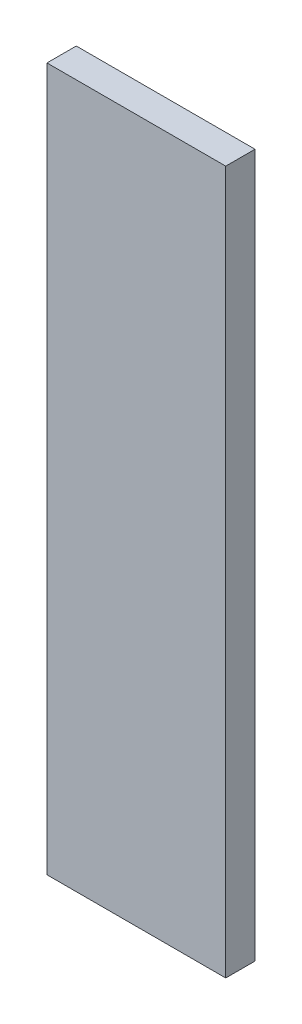
ISO-10303-21;
HEADER;
FILE_DESCRIPTION(('STEP AP214'),'2;1');
FILE_NAME('part.step','',(''),(''),'','','');
FILE_SCHEMA(('AUTOMOTIVE_DESIGN { 1 0 10303 214 1 1 1 1 }'));
ENDSEC;
DATA;
#1=APPLICATION_CONTEXT('core data for automotive mechanical design processes');
#2=APPLICATION_PROTOCOL_DEFINITION('international standard','automotive_design',2000,#1);
#3=PRODUCT_CONTEXT('',#1,'mechanical');
#4=PRODUCT('Part','Part','',(#3));
#5=PRODUCT_RELATED_PRODUCT_CATEGORY('part','',(#4));
#6=PRODUCT_DEFINITION_FORMATION('','',#4);
#7=PRODUCT_DEFINITION_CONTEXT('part definition',#1,'design');
#8=PRODUCT_DEFINITION('design','',#6,#7);
#9=PRODUCT_DEFINITION_SHAPE('','',#8);
#10=(LENGTH_UNIT() NAMED_UNIT(*) SI_UNIT(.MILLI.,.METRE.));
#11=(NAMED_UNIT(*) PLANE_ANGLE_UNIT() SI_UNIT($,.RADIAN.));
#12=(NAMED_UNIT(*) SI_UNIT($,.STERADIAN.) SOLID_ANGLE_UNIT());
#13=UNCERTAINTY_MEASURE_WITH_UNIT(LENGTH_MEASURE(1.E-05),#10,'distance_accuracy_value','');
#14=(GEOMETRIC_REPRESENTATION_CONTEXT(3) GLOBAL_UNCERTAINTY_ASSIGNED_CONTEXT((#13)) GLOBAL_UNIT_ASSIGNED_CONTEXT((#10,
#11,#12)) REPRESENTATION_CONTEXT('',''));
#15=CARTESIAN_POINT('',(0.,0.,0.));
#16=DIRECTION('',(0.,0.,1.));
#17=DIRECTION('',(1.,0.,0.));
#18=AXIS2_PLACEMENT_3D('',#15,#16,#17);
#19=CARTESIAN_POINT('',(-467.912060541022,58.5771354617902,6.35));
#20=DIRECTION('',(-1.,0.,0.));
#21=DIRECTION('',(0.,0.,1.));
#22=AXIS2_PLACEMENT_3D('',#19,#20,#21);
#23=PLANE('',#22);
#24=DIRECTION('',(0.,1.,0.));
#25=VECTOR('',#24,1.);
#26=CARTESIAN_POINT('',(-467.912060541022,58.5771354617902,0.));
#27=LINE('',#26,#25);
#28=CARTESIAN_POINT('',(-467.912060541022,58.5771354617902,0.));
#29=VERTEX_POINT('',#28);
#30=CARTESIAN_POINT('',(-467.912060541022,210.97713546179,0.));
#31=VERTEX_POINT('',#30);
#32=EDGE_CURVE('E102',#29,#31,#27,.T.);
#33=ORIENTED_EDGE('',*,*,#32,.F.);
#34=DIRECTION('',(0.,0.,-1.));
#35=VECTOR('',#34,1.);
#36=CARTESIAN_POINT('',(-467.912060541022,58.5771354617902,6.35));
#37=LINE('',#36,#35);
#38=CARTESIAN_POINT('',(-467.912060541022,58.5771354617902,6.35));
#39=VERTEX_POINT('',#38);
#40=EDGE_CURVE('E11',#39,#29,#37,.T.);
#41=ORIENTED_EDGE('',*,*,#40,.F.);
#42=DIRECTION('',(0.,1.,0.));
#43=VECTOR('',#42,1.);
#44=CARTESIAN_POINT('',(-467.912060541022,58.5771354617902,6.35));
#45=LINE('',#44,#43);
#46=CARTESIAN_POINT('',(-467.912060541022,210.97713546179,6.35));
#47=VERTEX_POINT('',#46);
#48=EDGE_CURVE('E97',#39,#47,#45,.T.);
#49=ORIENTED_EDGE('',*,*,#48,.T.);
#50=DIRECTION('',(0.,0.,-1.));
#51=VECTOR('',#50,1.);
#52=CARTESIAN_POINT('',(-467.912060541022,210.97713546179,6.35));
#53=LINE('',#52,#51);
#54=EDGE_CURVE('E40',#47,#31,#53,.T.);
#55=ORIENTED_EDGE('',*,*,#54,.T.);
#56=EDGE_LOOP('',(#33,#41,#49,#55));
#57=FACE_BOUND('',#56,.T.);
#58=ADVANCED_FACE('F37',(#57),#23,.T.);
#59=CARTESIAN_POINT('',(-467.912060541022,58.5771354617902,6.35));
#60=DIRECTION('',(0.,1.,0.));
#61=DIRECTION('',(-1.,0.,0.));
#62=AXIS2_PLACEMENT_3D('',#59,#60,#61);
#63=PLANE('',#62);
#64=DIRECTION('',(1.,0.,0.));
#65=VECTOR('',#64,1.);
#66=CARTESIAN_POINT('',(-467.912060541022,58.5771354617902,0.));
#67=LINE('',#66,#65);
#68=CARTESIAN_POINT('',(-429.164397652232,58.5771354617902,0.));
#69=VERTEX_POINT('',#68);
#70=EDGE_CURVE('E70',#29,#69,#67,.T.);
#71=ORIENTED_EDGE('',*,*,#70,.T.);
#72=DIRECTION('',(0.,0.,-1.));
#73=VECTOR('',#72,1.);
#74=CARTESIAN_POINT('',(-429.164397652232,58.5771354617902,6.35));
#75=LINE('',#74,#73);
#76=CARTESIAN_POINT('',(-429.164397652232,58.5771354617902,6.35));
#77=VERTEX_POINT('',#76);
#78=EDGE_CURVE('E46',#77,#69,#75,.T.);
#79=ORIENTED_EDGE('',*,*,#78,.F.);
#80=DIRECTION('',(1.,0.,0.));
#81=VECTOR('',#80,1.);
#82=CARTESIAN_POINT('',(-467.912060541022,58.5771354617902,6.35));
#83=LINE('',#82,#81);
#84=EDGE_CURVE('E87',#39,#77,#83,.T.);
#85=ORIENTED_EDGE('',*,*,#84,.F.);
#86=ORIENTED_EDGE('',*,*,#40,.T.);
#87=EDGE_LOOP('',(#71,#79,#85,#86));
#88=FACE_BOUND('',#87,.T.);
#89=ADVANCED_FACE('F112',(#88),#63,.F.);
#90=CARTESIAN_POINT('',(-429.164397652232,58.5771354617902,6.35));
#91=DIRECTION('',(-1.,0.,0.));
#92=DIRECTION('',(0.,0.,1.));
#93=AXIS2_PLACEMENT_3D('',#90,#91,#92);
#94=PLANE('',#93);
#95=DIRECTION('',(0.,1.,0.));
#96=VECTOR('',#95,1.);
#97=CARTESIAN_POINT('',(-429.164397652232,58.5771354617902,0.));
#98=LINE('',#97,#96);
#99=CARTESIAN_POINT('',(-429.164397652232,210.97713546179,0.));
#100=VERTEX_POINT('',#99);
#101=EDGE_CURVE('E94',#69,#100,#98,.T.);
#102=ORIENTED_EDGE('',*,*,#101,.T.);
#103=DIRECTION('',(0.,0.,-1.));
#104=VECTOR('',#103,1.);
#105=CARTESIAN_POINT('',(-429.164397652232,210.97713546179,6.35));
#106=LINE('',#105,#104);
#107=CARTESIAN_POINT('',(-429.164397652232,210.97713546179,6.35));
#108=VERTEX_POINT('',#107);
#109=EDGE_CURVE('E91',#108,#100,#106,.T.);
#110=ORIENTED_EDGE('',*,*,#109,.F.);
#111=DIRECTION('',(0.,1.,0.));
#112=VECTOR('',#111,1.);
#113=CARTESIAN_POINT('',(-429.164397652232,58.5771354617902,6.35));
#114=LINE('',#113,#112);
#115=EDGE_CURVE('E82',#77,#108,#114,.T.);
#116=ORIENTED_EDGE('',*,*,#115,.F.);
#117=ORIENTED_EDGE('',*,*,#78,.T.);
#118=EDGE_LOOP('',(#102,#110,#116,#117));
#119=FACE_BOUND('',#118,.T.);
#120=ADVANCED_FACE('F92',(#119),#94,.F.);
#121=CARTESIAN_POINT('',(-467.912060541022,210.97713546179,6.35));
#122=DIRECTION('',(0.,1.,0.));
#123=DIRECTION('',(0.,0.,1.));
#124=AXIS2_PLACEMENT_3D('',#121,#122,#123);
#125=PLANE('',#124);
#126=DIRECTION('',(1.,0.,0.));
#127=VECTOR('',#126,1.);
#128=CARTESIAN_POINT('',(-467.912060541022,210.97713546179,0.));
#129=LINE('',#128,#127);
#130=EDGE_CURVE('E105',#31,#100,#129,.T.);
#131=ORIENTED_EDGE('',*,*,#130,.F.);
#132=ORIENTED_EDGE('',*,*,#54,.F.);
#133=DIRECTION('',(1.,0.,0.));
#134=VECTOR('',#133,1.);
#135=CARTESIAN_POINT('',(-467.912060541022,210.97713546179,6.35));
#136=LINE('',#135,#134);
#137=EDGE_CURVE('E86',#47,#108,#136,.T.);
#138=ORIENTED_EDGE('',*,*,#137,.T.);
#139=ORIENTED_EDGE('',*,*,#109,.T.);
#140=EDGE_LOOP('',(#131,#132,#138,#139));
#141=FACE_BOUND('',#140,.T.);
#142=ADVANCED_FACE('F96',(#141),#125,.T.);
#143=CARTESIAN_POINT('',(0.,0.,6.35));
#144=DIRECTION('',(0.,0.,-1.));
#145=DIRECTION('',(-1.,0.,0.));
#146=AXIS2_PLACEMENT_3D('',#143,#144,#145);
#147=PLANE('',#146);
#148=ORIENTED_EDGE('',*,*,#48,.F.);
#149=ORIENTED_EDGE('',*,*,#84,.T.);
#150=ORIENTED_EDGE('',*,*,#115,.T.);
#151=ORIENTED_EDGE('',*,*,#137,.F.);
#152=EDGE_LOOP('',(#148,#149,#150,#151));
#153=FACE_BOUND('',#152,.T.);
#154=ADVANCED_FACE('F85',(#153),#147,.F.);
#155=CARTESIAN_POINT('',(0.,0.,0.));
#156=DIRECTION('',(0.,0.,-1.));
#157=DIRECTION('',(-1.,0.,0.));
#158=AXIS2_PLACEMENT_3D('',#155,#156,#157);
#159=PLANE('',#158);
#160=ORIENTED_EDGE('',*,*,#32,.T.);
#161=ORIENTED_EDGE('',*,*,#130,.T.);
#162=ORIENTED_EDGE('',*,*,#101,.F.);
#163=ORIENTED_EDGE('',*,*,#70,.F.);
#164=EDGE_LOOP('',(#160,#161,#162,#163));
#165=FACE_BOUND('',#164,.T.);
#166=ADVANCED_FACE('F110',(#165),#159,.T.);
#167=CLOSED_SHELL('',(#58,#89,#120,#142,#154,#166));
#168=MANIFOLD_SOLID_BREP('B2',#167);
#169=ADVANCED_BREP_SHAPE_REPRESENTATION('',(#18,#168),#14);
#170=SHAPE_DEFINITION_REPRESENTATION(#9,#169);
ENDSEC;
END-ISO-10303-21;
